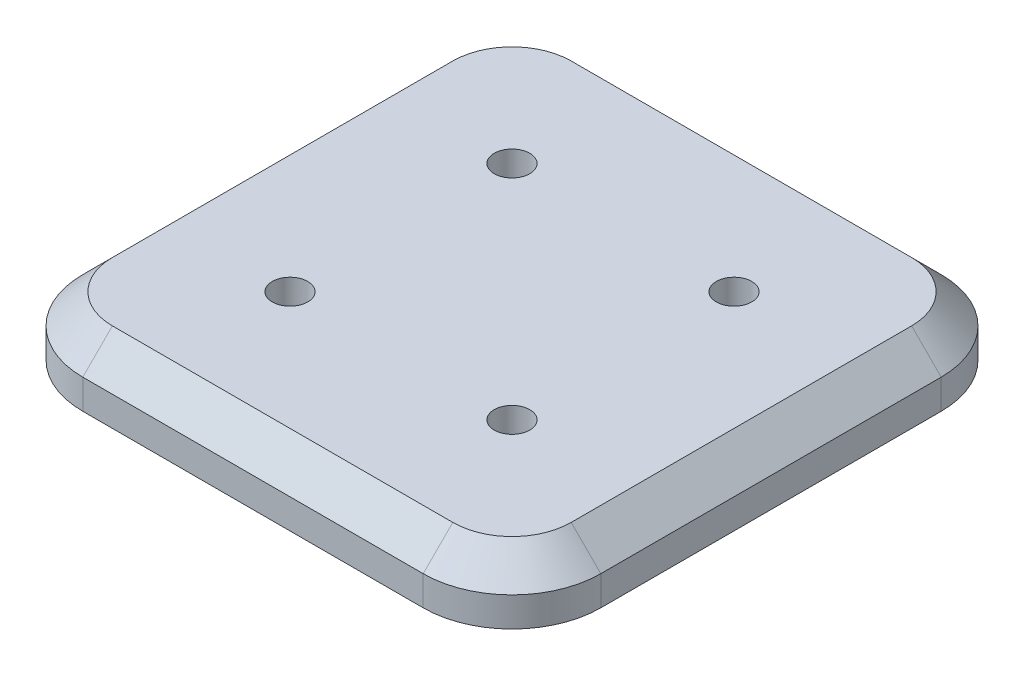
ISO-10303-21;
HEADER;
FILE_DESCRIPTION(('STEP AP214'),'2;1');
FILE_NAME('part.step','',(''),(''),'','','');
FILE_SCHEMA(('AUTOMOTIVE_DESIGN { 1 0 10303 214 1 1 1 1 }'));
ENDSEC;
DATA;
#1=APPLICATION_CONTEXT('core data for automotive mechanical design processes');
#2=APPLICATION_PROTOCOL_DEFINITION('international standard','automotive_design',2000,#1);
#3=PRODUCT_CONTEXT('',#1,'mechanical');
#4=PRODUCT('Part','Part','',(#3));
#5=PRODUCT_RELATED_PRODUCT_CATEGORY('part','',(#4));
#6=PRODUCT_DEFINITION_FORMATION('','',#4);
#7=PRODUCT_DEFINITION_CONTEXT('part definition',#1,'design');
#8=PRODUCT_DEFINITION('design','',#6,#7);
#9=PRODUCT_DEFINITION_SHAPE('','',#8);
#10=(LENGTH_UNIT() NAMED_UNIT(*) SI_UNIT(.MILLI.,.METRE.));
#11=(NAMED_UNIT(*) PLANE_ANGLE_UNIT() SI_UNIT($,.RADIAN.));
#12=(NAMED_UNIT(*) SI_UNIT($,.STERADIAN.) SOLID_ANGLE_UNIT());
#13=UNCERTAINTY_MEASURE_WITH_UNIT(LENGTH_MEASURE(1.E-05),#10,'distance_accuracy_value','');
#14=(GEOMETRIC_REPRESENTATION_CONTEXT(3) GLOBAL_UNCERTAINTY_ASSIGNED_CONTEXT((#13)) GLOBAL_UNIT_ASSIGNED_CONTEXT((#10,
#11,#12)) REPRESENTATION_CONTEXT('',''));
#15=CARTESIAN_POINT('',(0.,0.,0.));
#16=DIRECTION('',(0.,0.,1.));
#17=DIRECTION('',(1.,0.,0.));
#18=AXIS2_PLACEMENT_3D('',#15,#16,#17);
#19=CARTESIAN_POINT('',(-57.5,10.,57.5));
#20=DIRECTION('',(0.,-1.,0.));
#21=DIRECTION('',(0.,0.,-1.));
#22=AXIS2_PLACEMENT_3D('',#19,#20,#21);
#23=CYLINDRICAL_SURFACE('',#22,30.);
#24=DIRECTION('',(0.,-1.,0.));
#25=VECTOR('',#24,1.);
#26=CARTESIAN_POINT('',(-57.5,10.,87.5));
#27=LINE('',#26,#25);
#28=CARTESIAN_POINT('',(-57.5,0.,87.5));
#29=VERTEX_POINT('',#28);
#30=CARTESIAN_POINT('',(-57.5,-10.,87.5));
#31=VERTEX_POINT('',#30);
#32=EDGE_CURVE('E133',#29,#31,#27,.T.);
#33=ORIENTED_EDGE('',*,*,#32,.F.);
#34=CARTESIAN_POINT('',(-57.5,0.,57.5));
#35=DIRECTION('',(0.,-1.,0.));
#36=DIRECTION('',(0.,0.,-1.));
#37=AXIS2_PLACEMENT_3D('',#34,#35,#36);
#38=CIRCLE('',#37,30.);
#39=CARTESIAN_POINT('',(-87.5,0.,57.5));
#40=VERTEX_POINT('',#39);
#41=EDGE_CURVE('E12',#29,#40,#38,.T.);
#42=ORIENTED_EDGE('',*,*,#41,.T.);
#43=DIRECTION('',(0.,-1.,0.));
#44=VECTOR('',#43,1.);
#45=CARTESIAN_POINT('',(-87.5,10.,57.5));
#46=LINE('',#45,#44);
#47=CARTESIAN_POINT('',(-87.5,-10.,57.5));
#48=VERTEX_POINT('',#47);
#49=EDGE_CURVE('E156',#40,#48,#46,.T.);
#50=ORIENTED_EDGE('',*,*,#49,.T.);
#51=CARTESIAN_POINT('',(-57.5,-10.,57.5));
#52=DIRECTION('',(0.,1.,0.));
#53=DIRECTION('',(0.,0.,-1.));
#54=AXIS2_PLACEMENT_3D('',#51,#52,#53);
#55=CIRCLE('',#54,30.);
#56=EDGE_CURVE('E149',#48,#31,#55,.T.);
#57=ORIENTED_EDGE('',*,*,#56,.T.);
#58=EDGE_LOOP('',(#33,#42,#50,#57));
#59=FACE_BOUND('',#58,.T.);
#60=ADVANCED_FACE('F43',(#59),#23,.T.);
#61=CARTESIAN_POINT('',(57.5,10.,87.5));
#62=DIRECTION('',(0.,0.,-1.));
#63=DIRECTION('',(-1.,0.,0.));
#64=AXIS2_PLACEMENT_3D('',#61,#62,#63);
#65=PLANE('',#64);
#66=DIRECTION('',(0.,-1.,0.));
#67=VECTOR('',#66,1.);
#68=CARTESIAN_POINT('',(57.5,10.,87.5));
#69=LINE('',#68,#67);
#70=CARTESIAN_POINT('',(57.5,0.,87.5));
#71=VERTEX_POINT('',#70);
#72=CARTESIAN_POINT('',(57.5,-10.,87.5));
#73=VERTEX_POINT('',#72);
#74=EDGE_CURVE('E143',#71,#73,#69,.T.);
#75=ORIENTED_EDGE('',*,*,#74,.F.);
#76=DIRECTION('',(-1.,0.,0.));
#77=VECTOR('',#76,1.);
#78=CARTESIAN_POINT('',(57.5,0.,87.5));
#79=LINE('',#78,#77);
#80=EDGE_CURVE('E54',#71,#29,#79,.T.);
#81=ORIENTED_EDGE('',*,*,#80,.T.);
#82=ORIENTED_EDGE('',*,*,#32,.T.);
#83=DIRECTION('',(1.,0.,0.));
#84=VECTOR('',#83,1.);
#85=CARTESIAN_POINT('',(57.5,-10.,87.5));
#86=LINE('',#85,#84);
#87=EDGE_CURVE('E136',#31,#73,#86,.T.);
#88=ORIENTED_EDGE('',*,*,#87,.T.);
#89=EDGE_LOOP('',(#75,#81,#82,#88));
#90=FACE_BOUND('',#89,.T.);
#91=ADVANCED_FACE('F135',(#90),#65,.F.);
#92=CARTESIAN_POINT('',(57.5,10.,57.5));
#93=DIRECTION('',(0.,-1.,0.));
#94=DIRECTION('',(0.,0.,-1.));
#95=AXIS2_PLACEMENT_3D('',#92,#93,#94);
#96=CYLINDRICAL_SURFACE('',#95,30.);
#97=DIRECTION('',(0.,-1.,0.));
#98=VECTOR('',#97,1.);
#99=CARTESIAN_POINT('',(87.5,10.,57.5));
#100=LINE('',#99,#98);
#101=CARTESIAN_POINT('',(87.5,0.,57.5));
#102=VERTEX_POINT('',#101);
#103=CARTESIAN_POINT('',(87.5,-10.,57.5));
#104=VERTEX_POINT('',#103);
#105=EDGE_CURVE('E202',#102,#104,#100,.T.);
#106=ORIENTED_EDGE('',*,*,#105,.F.);
#107=CARTESIAN_POINT('',(57.5,0.,57.5));
#108=DIRECTION('',(0.,-1.,0.));
#109=DIRECTION('',(0.,0.,-1.));
#110=AXIS2_PLACEMENT_3D('',#107,#108,#109);
#111=CIRCLE('',#110,30.);
#112=EDGE_CURVE('E69',#102,#71,#111,.T.);
#113=ORIENTED_EDGE('',*,*,#112,.T.);
#114=ORIENTED_EDGE('',*,*,#74,.T.);
#115=CARTESIAN_POINT('',(57.5,-10.,57.5));
#116=DIRECTION('',(0.,1.,0.));
#117=DIRECTION('',(0.,0.,-1.));
#118=AXIS2_PLACEMENT_3D('',#115,#116,#117);
#119=CIRCLE('',#118,30.);
#120=EDGE_CURVE('E152',#73,#104,#119,.T.);
#121=ORIENTED_EDGE('',*,*,#120,.T.);
#122=EDGE_LOOP('',(#106,#113,#114,#121));
#123=FACE_BOUND('',#122,.T.);
#124=ADVANCED_FACE('F329',(#123),#96,.T.);
#125=CARTESIAN_POINT('',(87.5,10.,-57.5));
#126=DIRECTION('',(-1.,0.,0.));
#127=DIRECTION('',(0.,0.,1.));
#128=AXIS2_PLACEMENT_3D('',#125,#126,#127);
#129=PLANE('',#128);
#130=DIRECTION('',(0.,-1.,0.));
#131=VECTOR('',#130,1.);
#132=CARTESIAN_POINT('',(87.5,10.,-57.5));
#133=LINE('',#132,#131);
#134=CARTESIAN_POINT('',(87.5,0.,-57.5));
#135=VERTEX_POINT('',#134);
#136=CARTESIAN_POINT('',(87.5,-10.,-57.5));
#137=VERTEX_POINT('',#136);
#138=EDGE_CURVE('E199',#135,#137,#133,.T.);
#139=ORIENTED_EDGE('',*,*,#138,.F.);
#140=DIRECTION('',(0.,0.,1.));
#141=VECTOR('',#140,1.);
#142=CARTESIAN_POINT('',(87.5,0.,-57.5));
#143=LINE('',#142,#141);
#144=EDGE_CURVE('E244',#135,#102,#143,.T.);
#145=ORIENTED_EDGE('',*,*,#144,.T.);
#146=ORIENTED_EDGE('',*,*,#105,.T.);
#147=DIRECTION('',(0.,0.,-1.));
#148=VECTOR('',#147,1.);
#149=CARTESIAN_POINT('',(87.5,-10.,-57.5));
#150=LINE('',#149,#148);
#151=EDGE_CURVE('E169',#104,#137,#150,.T.);
#152=ORIENTED_EDGE('',*,*,#151,.T.);
#153=EDGE_LOOP('',(#139,#145,#146,#152));
#154=FACE_BOUND('',#153,.T.);
#155=ADVANCED_FACE('F327',(#154),#129,.F.);
#156=CARTESIAN_POINT('',(57.5,10.,-57.5));
#157=DIRECTION('',(0.,-1.,0.));
#158=DIRECTION('',(0.,0.,-1.));
#159=AXIS2_PLACEMENT_3D('',#156,#157,#158);
#160=CYLINDRICAL_SURFACE('',#159,30.);
#161=DIRECTION('',(0.,-1.,0.));
#162=VECTOR('',#161,1.);
#163=CARTESIAN_POINT('',(57.5,10.,-87.5));
#164=LINE('',#163,#162);
#165=CARTESIAN_POINT('',(57.5,0.,-87.5));
#166=VERTEX_POINT('',#165);
#167=CARTESIAN_POINT('',(57.5,-10.,-87.5));
#168=VERTEX_POINT('',#167);
#169=EDGE_CURVE('E196',#166,#168,#164,.T.);
#170=ORIENTED_EDGE('',*,*,#169,.F.);
#171=CARTESIAN_POINT('',(57.5,0.,-57.5));
#172=DIRECTION('',(0.,-1.,0.));
#173=DIRECTION('',(0.,0.,-1.));
#174=AXIS2_PLACEMENT_3D('',#171,#172,#173);
#175=CIRCLE('',#174,30.);
#176=EDGE_CURVE('E241',#166,#135,#175,.T.);
#177=ORIENTED_EDGE('',*,*,#176,.T.);
#178=ORIENTED_EDGE('',*,*,#138,.T.);
#179=CARTESIAN_POINT('',(57.5,-10.,-57.5));
#180=DIRECTION('',(0.,1.,0.));
#181=DIRECTION('',(0.,0.,-1.));
#182=AXIS2_PLACEMENT_3D('',#179,#180,#181);
#183=CIRCLE('',#182,30.);
#184=EDGE_CURVE('E173',#137,#168,#183,.T.);
#185=ORIENTED_EDGE('',*,*,#184,.T.);
#186=EDGE_LOOP('',(#170,#177,#178,#185));
#187=FACE_BOUND('',#186,.T.);
#188=ADVANCED_FACE('F325',(#187),#160,.T.);
#189=CARTESIAN_POINT('',(-57.5,10.,-87.5));
#190=DIRECTION('',(0.,0.,1.));
#191=DIRECTION('',(1.,0.,0.));
#192=AXIS2_PLACEMENT_3D('',#189,#190,#191);
#193=PLANE('',#192);
#194=DIRECTION('',(0.,-1.,0.));
#195=VECTOR('',#194,1.);
#196=CARTESIAN_POINT('',(-57.5,10.,-87.5));
#197=LINE('',#196,#195);
#198=CARTESIAN_POINT('',(-57.5,0.,-87.5));
#199=VERTEX_POINT('',#198);
#200=CARTESIAN_POINT('',(-57.5,-10.,-87.5));
#201=VERTEX_POINT('',#200);
#202=EDGE_CURVE('E193',#199,#201,#197,.T.);
#203=ORIENTED_EDGE('',*,*,#202,.F.);
#204=DIRECTION('',(1.,0.,0.));
#205=VECTOR('',#204,1.);
#206=CARTESIAN_POINT('',(-57.5,0.,-87.5));
#207=LINE('',#206,#205);
#208=EDGE_CURVE('E238',#199,#166,#207,.T.);
#209=ORIENTED_EDGE('',*,*,#208,.T.);
#210=ORIENTED_EDGE('',*,*,#169,.T.);
#211=DIRECTION('',(-1.,0.,0.));
#212=VECTOR('',#211,1.);
#213=CARTESIAN_POINT('',(-57.5,-10.,-87.5));
#214=LINE('',#213,#212);
#215=EDGE_CURVE('E177',#168,#201,#214,.T.);
#216=ORIENTED_EDGE('',*,*,#215,.T.);
#217=EDGE_LOOP('',(#203,#209,#210,#216));
#218=FACE_BOUND('',#217,.T.);
#219=ADVANCED_FACE('F313',(#218),#193,.F.);
#220=CARTESIAN_POINT('',(-57.5,10.,-57.5));
#221=DIRECTION('',(0.,-1.,0.));
#222=DIRECTION('',(0.,0.,-1.));
#223=AXIS2_PLACEMENT_3D('',#220,#221,#222);
#224=CYLINDRICAL_SURFACE('',#223,30.);
#225=DIRECTION('',(0.,-1.,0.));
#226=VECTOR('',#225,1.);
#227=CARTESIAN_POINT('',(-87.5,10.,-57.5));
#228=LINE('',#227,#226);
#229=CARTESIAN_POINT('',(-87.5,0.,-57.5));
#230=VERTEX_POINT('',#229);
#231=CARTESIAN_POINT('',(-87.5,-10.,-57.5));
#232=VERTEX_POINT('',#231);
#233=EDGE_CURVE('E190',#230,#232,#228,.T.);
#234=ORIENTED_EDGE('',*,*,#233,.F.);
#235=CARTESIAN_POINT('',(-57.5,0.,-57.5));
#236=DIRECTION('',(0.,-1.,0.));
#237=DIRECTION('',(0.,0.,-1.));
#238=AXIS2_PLACEMENT_3D('',#235,#236,#237);
#239=CIRCLE('',#238,30.);
#240=EDGE_CURVE('E235',#230,#199,#239,.T.);
#241=ORIENTED_EDGE('',*,*,#240,.T.);
#242=ORIENTED_EDGE('',*,*,#202,.T.);
#243=CARTESIAN_POINT('',(-57.5,-10.,-57.5));
#244=DIRECTION('',(0.,1.,0.));
#245=DIRECTION('',(0.,0.,1.));
#246=AXIS2_PLACEMENT_3D('',#243,#244,#245);
#247=CIRCLE('',#246,30.);
#248=EDGE_CURVE('E181',#201,#232,#247,.T.);
#249=ORIENTED_EDGE('',*,*,#248,.T.);
#250=EDGE_LOOP('',(#234,#241,#242,#249));
#251=FACE_BOUND('',#250,.T.);
#252=ADVANCED_FACE('F310',(#251),#224,.T.);
#253=CARTESIAN_POINT('',(-87.5,10.,57.5));
#254=DIRECTION('',(1.,0.,0.));
#255=DIRECTION('',(0.,0.,-1.));
#256=AXIS2_PLACEMENT_3D('',#253,#254,#255);
#257=PLANE('',#256);
#258=ORIENTED_EDGE('',*,*,#49,.F.);
#259=DIRECTION('',(0.,0.,-1.));
#260=VECTOR('',#259,1.);
#261=CARTESIAN_POINT('',(-87.5,0.,57.5));
#262=LINE('',#261,#260);
#263=EDGE_CURVE('E231',#40,#230,#262,.T.);
#264=ORIENTED_EDGE('',*,*,#263,.T.);
#265=ORIENTED_EDGE('',*,*,#233,.T.);
#266=DIRECTION('',(0.,0.,1.));
#267=VECTOR('',#266,1.);
#268=CARTESIAN_POINT('',(-87.5,-10.,57.5));
#269=LINE('',#268,#267);
#270=EDGE_CURVE('E185',#232,#48,#269,.T.);
#271=ORIENTED_EDGE('',*,*,#270,.T.);
#272=EDGE_LOOP('',(#258,#264,#265,#271));
#273=FACE_BOUND('',#272,.T.);
#274=ADVANCED_FACE('F297',(#273),#257,.F.);
#275=CARTESIAN_POINT('',(-57.5,10.,57.5));
#276=DIRECTION('',(0.,-1.,0.));
#277=DIRECTION('',(0.,0.,-1.));
#278=AXIS2_PLACEMENT_3D('',#275,#276,#277);
#279=PLANE('',#278);
#280=CARTESIAN_POINT('',(-37.5,10.,-37.5));
#281=DIRECTION('',(0.,1.,0.));
#282=DIRECTION('',(0.,0.,-1.));
#283=AXIS2_PLACEMENT_3D('',#280,#281,#282);
#284=CIRCLE('',#283,6.);
#285=CARTESIAN_POINT('',(-37.5,10.,-43.5));
#286=VERTEX_POINT('',#285);
#287=EDGE_CURVE('E629',#286,#286,#284,.T.);
#288=ORIENTED_EDGE('',*,*,#287,.F.);
#289=EDGE_LOOP('',(#288));
#290=FACE_BOUND('',#289,.T.);
#291=CARTESIAN_POINT('',(37.5,10.,37.5));
#292=DIRECTION('',(0.,1.,0.));
#293=DIRECTION('',(0.,0.,-1.));
#294=AXIS2_PLACEMENT_3D('',#291,#292,#293);
#295=CIRCLE('',#294,6.);
#296=CARTESIAN_POINT('',(37.5,10.,31.5));
#297=VERTEX_POINT('',#296);
#298=EDGE_CURVE('E628',#297,#297,#295,.T.);
#299=ORIENTED_EDGE('',*,*,#298,.F.);
#300=EDGE_LOOP('',(#299));
#301=FACE_BOUND('',#300,.T.);
#302=CARTESIAN_POINT('',(-37.5,10.,37.5));
#303=DIRECTION('',(0.,1.,0.));
#304=DIRECTION('',(0.,0.,1.));
#305=AXIS2_PLACEMENT_3D('',#302,#303,#304);
#306=CIRCLE('',#305,6.);
#307=CARTESIAN_POINT('',(-37.5,10.,43.5));
#308=VERTEX_POINT('',#307);
#309=EDGE_CURVE('E620',#308,#308,#306,.T.);
#310=ORIENTED_EDGE('',*,*,#309,.F.);
#311=EDGE_LOOP('',(#310));
#312=FACE_BOUND('',#311,.T.);
#313=CARTESIAN_POINT('',(37.5,10.,-37.5));
#314=DIRECTION('',(0.,1.,0.));
#315=DIRECTION('',(0.,0.,1.));
#316=AXIS2_PLACEMENT_3D('',#313,#314,#315);
#317=CIRCLE('',#316,6.);
#318=CARTESIAN_POINT('',(37.5,10.,-31.5));
#319=VERTEX_POINT('',#318);
#320=EDGE_CURVE('E638',#319,#319,#317,.T.);
#321=ORIENTED_EDGE('',*,*,#320,.F.);
#322=EDGE_LOOP('',(#321));
#323=FACE_BOUND('',#322,.T.);
#324=CARTESIAN_POINT('',(-57.5,10.,-57.5));
#325=DIRECTION('',(0.,-1.,0.));
#326=DIRECTION('',(0.,0.,-1.));
#327=AXIS2_PLACEMENT_3D('',#324,#325,#326);
#328=CIRCLE('',#327,20.);
#329=CARTESIAN_POINT('',(-57.5,10.,-77.5));
#330=VERTEX_POINT('',#329);
#331=CARTESIAN_POINT('',(-77.5,10.,-57.5));
#332=VERTEX_POINT('',#331);
#333=EDGE_CURVE('E224',#330,#332,#328,.F.);
#334=ORIENTED_EDGE('',*,*,#333,.T.);
#335=DIRECTION('',(0.,0.,1.));
#336=VECTOR('',#335,1.);
#337=CARTESIAN_POINT('',(-77.5,10.,57.5));
#338=LINE('',#337,#336);
#339=CARTESIAN_POINT('',(-77.5,10.,57.5));
#340=VERTEX_POINT('',#339);
#341=EDGE_CURVE('E227',#332,#340,#338,.T.);
#342=ORIENTED_EDGE('',*,*,#341,.T.);
#343=CARTESIAN_POINT('',(-57.5,10.,57.5));
#344=DIRECTION('',(0.,-1.,0.));
#345=DIRECTION('',(0.,0.,-1.));
#346=AXIS2_PLACEMENT_3D('',#343,#344,#345);
#347=CIRCLE('',#346,19.9999999999999);
#348=CARTESIAN_POINT('',(-57.5,10.,77.5));
#349=VERTEX_POINT('',#348);
#350=EDGE_CURVE('E142',#340,#349,#347,.F.);
#351=ORIENTED_EDGE('',*,*,#350,.T.);
#352=DIRECTION('',(1.,0.,0.));
#353=VECTOR('',#352,1.);
#354=CARTESIAN_POINT('',(-57.5,10.,77.5));
#355=LINE('',#354,#353);
#356=CARTESIAN_POINT('',(57.5,10.,77.5));
#357=VERTEX_POINT('',#356);
#358=EDGE_CURVE('E209',#349,#357,#355,.T.);
#359=ORIENTED_EDGE('',*,*,#358,.T.);
#360=CARTESIAN_POINT('',(57.5,10.,57.5));
#361=DIRECTION('',(0.,-1.,0.));
#362=DIRECTION('',(0.,0.,-1.));
#363=AXIS2_PLACEMENT_3D('',#360,#361,#362);
#364=CIRCLE('',#363,19.9999999999999);
#365=CARTESIAN_POINT('',(77.5,10.,57.5));
#366=VERTEX_POINT('',#365);
#367=EDGE_CURVE('E212',#357,#366,#364,.F.);
#368=ORIENTED_EDGE('',*,*,#367,.T.);
#369=DIRECTION('',(0.,0.,-1.));
#370=VECTOR('',#369,1.);
#371=CARTESIAN_POINT('',(77.5,10.,57.5));
#372=LINE('',#371,#370);
#373=CARTESIAN_POINT('',(77.5,10.,-57.5));
#374=VERTEX_POINT('',#373);
#375=EDGE_CURVE('E215',#366,#374,#372,.T.);
#376=ORIENTED_EDGE('',*,*,#375,.T.);
#377=CARTESIAN_POINT('',(57.5,10.,-57.5));
#378=DIRECTION('',(0.,-1.,0.));
#379=DIRECTION('',(0.,0.,-1.));
#380=AXIS2_PLACEMENT_3D('',#377,#378,#379);
#381=CIRCLE('',#380,20.);
#382=CARTESIAN_POINT('',(57.5,10.,-77.5));
#383=VERTEX_POINT('',#382);
#384=EDGE_CURVE('E218',#374,#383,#381,.F.);
#385=ORIENTED_EDGE('',*,*,#384,.T.);
#386=DIRECTION('',(-1.,0.,0.));
#387=VECTOR('',#386,1.);
#388=CARTESIAN_POINT('',(-57.5,10.,-77.5));
#389=LINE('',#388,#387);
#390=EDGE_CURVE('E221',#383,#330,#389,.T.);
#391=ORIENTED_EDGE('',*,*,#390,.T.);
#392=EDGE_LOOP('',(#334,#342,#351,#359,#368,#376,#385,#391));
#393=FACE_BOUND('',#392,.T.);
#394=ADVANCED_FACE('F285',(#290,#301,#312,#323,#393),#279,.F.);
#395=CARTESIAN_POINT('',(-57.5,-10.,57.5));
#396=DIRECTION('',(0.,-1.,0.));
#397=DIRECTION('',(0.,0.,-1.));
#398=AXIS2_PLACEMENT_3D('',#395,#396,#397);
#399=PLANE('',#398);
#400=CARTESIAN_POINT('',(-62.5,-10.,62.5));
#401=DIRECTION('',(0.,-1.,0.));
#402=DIRECTION('',(0.,0.,1.));
#403=AXIS2_PLACEMENT_3D('',#400,#401,#402);
#404=CIRCLE('',#403,6.);
#405=CARTESIAN_POINT('',(-62.5,-10.,68.5));
#406=VERTEX_POINT('',#405);
#407=EDGE_CURVE('E597',#406,#406,#404,.T.);
#408=ORIENTED_EDGE('',*,*,#407,.F.);
#409=EDGE_LOOP('',(#408));
#410=FACE_BOUND('',#409,.T.);
#411=CARTESIAN_POINT('',(62.5,-10.,-62.5));
#412=DIRECTION('',(0.,-1.,0.));
#413=DIRECTION('',(0.,0.,1.));
#414=AXIS2_PLACEMENT_3D('',#411,#412,#413);
#415=CIRCLE('',#414,6.);
#416=CARTESIAN_POINT('',(62.5,-10.,-56.5));
#417=VERTEX_POINT('',#416);
#418=EDGE_CURVE('E609',#417,#417,#415,.T.);
#419=ORIENTED_EDGE('',*,*,#418,.F.);
#420=EDGE_LOOP('',(#419));
#421=FACE_BOUND('',#420,.T.);
#422=CARTESIAN_POINT('',(-62.5,-10.,-62.5));
#423=DIRECTION('',(0.,-1.,0.));
#424=DIRECTION('',(0.,0.,-1.));
#425=AXIS2_PLACEMENT_3D('',#422,#423,#424);
#426=CIRCLE('',#425,6.);
#427=CARTESIAN_POINT('',(-62.5,-10.,-68.5));
#428=VERTEX_POINT('',#427);
#429=EDGE_CURVE('E673',#428,#428,#426,.T.);
#430=ORIENTED_EDGE('',*,*,#429,.F.);
#431=EDGE_LOOP('',(#430));
#432=FACE_BOUND('',#431,.T.);
#433=CARTESIAN_POINT('',(62.5,-10.,62.5));
#434=DIRECTION('',(0.,-1.,0.));
#435=DIRECTION('',(0.,0.,-1.));
#436=AXIS2_PLACEMENT_3D('',#433,#434,#435);
#437=CIRCLE('',#436,6.);
#438=CARTESIAN_POINT('',(62.5,-10.,56.5));
#439=VERTEX_POINT('',#438);
#440=EDGE_CURVE('E596',#439,#439,#437,.T.);
#441=ORIENTED_EDGE('',*,*,#440,.F.);
#442=EDGE_LOOP('',(#441));
#443=FACE_BOUND('',#442,.T.);
#444=ORIENTED_EDGE('',*,*,#56,.F.);
#445=ORIENTED_EDGE('',*,*,#270,.F.);
#446=ORIENTED_EDGE('',*,*,#248,.F.);
#447=ORIENTED_EDGE('',*,*,#215,.F.);
#448=ORIENTED_EDGE('',*,*,#184,.F.);
#449=ORIENTED_EDGE('',*,*,#151,.F.);
#450=ORIENTED_EDGE('',*,*,#120,.F.);
#451=ORIENTED_EDGE('',*,*,#87,.F.);
#452=EDGE_LOOP('',(#444,#445,#446,#447,#448,#449,#450,#451));
#453=FACE_BOUND('',#452,.T.);
#454=ADVANCED_FACE('F147',(#410,#421,#432,#443,#453),#399,.T.);
#455=CARTESIAN_POINT('',(77.5,10.,57.5));
#456=DIRECTION('',(-0.707106781186548,-0.707106781186547,0.));
#457=DIRECTION('',(0.,0.,-1.));
#458=AXIS2_PLACEMENT_3D('',#455,#456,#457);
#459=PLANE('',#458);
#460=DIRECTION('',(-0.707106781186547,0.707106781186548,0.));
#461=VECTOR('',#460,1.);
#462=CARTESIAN_POINT('',(87.5,0.,57.5));
#463=LINE('',#462,#461);
#464=EDGE_CURVE('E162',#102,#366,#463,.T.);
#465=ORIENTED_EDGE('',*,*,#464,.F.);
#466=ORIENTED_EDGE('',*,*,#144,.F.);
#467=DIRECTION('',(0.707106781186547,-0.707106781186548,0.));
#468=VECTOR('',#467,1.);
#469=CARTESIAN_POINT('',(77.5,10.,-57.5));
#470=LINE('',#469,#468);
#471=EDGE_CURVE('E48',#374,#135,#470,.T.);
#472=ORIENTED_EDGE('',*,*,#471,.F.);
#473=ORIENTED_EDGE('',*,*,#375,.F.);
#474=EDGE_LOOP('',(#465,#466,#472,#473));
#475=FACE_BOUND('',#474,.T.);
#476=ADVANCED_FACE('F46',(#475),#459,.F.);
#477=CARTESIAN_POINT('',(57.5,10.,-57.5));
#478=DIRECTION('',(0.,-1.,0.));
#479=DIRECTION('',(0.,0.,-1.));
#480=AXIS2_PLACEMENT_3D('',#477,#478,#479);
#481=CONICAL_SURFACE('',#480,20.,0.785398163397448);
#482=ORIENTED_EDGE('',*,*,#471,.T.);
#483=ORIENTED_EDGE('',*,*,#176,.F.);
#484=DIRECTION('',(0.,-0.707106781186548,-0.707106781186547));
#485=VECTOR('',#484,1.);
#486=CARTESIAN_POINT('',(57.5,10.,-77.5));
#487=LINE('',#486,#485);
#488=EDGE_CURVE('E269',#383,#166,#487,.T.);
#489=ORIENTED_EDGE('',*,*,#488,.F.);
#490=ORIENTED_EDGE('',*,*,#384,.F.);
#491=EDGE_LOOP('',(#482,#483,#489,#490));
#492=FACE_BOUND('',#491,.T.);
#493=ADVANCED_FACE('F322',(#492),#481,.T.);
#494=CARTESIAN_POINT('',(57.5,10.,57.5));
#495=DIRECTION('',(0.,-1.,0.));
#496=DIRECTION('',(0.,0.,-1.));
#497=AXIS2_PLACEMENT_3D('',#494,#495,#496);
#498=CONICAL_SURFACE('',#497,19.9999999999999,0.785398163397448);
#499=ORIENTED_EDGE('',*,*,#464,.T.);
#500=ORIENTED_EDGE('',*,*,#367,.F.);
#501=DIRECTION('',(0.,0.707106781186548,-0.707106781186547));
#502=VECTOR('',#501,1.);
#503=CARTESIAN_POINT('',(57.5,0.,87.5));
#504=LINE('',#503,#502);
#505=EDGE_CURVE('E265',#71,#357,#504,.T.);
#506=ORIENTED_EDGE('',*,*,#505,.F.);
#507=ORIENTED_EDGE('',*,*,#112,.F.);
#508=EDGE_LOOP('',(#499,#500,#506,#507));
#509=FACE_BOUND('',#508,.T.);
#510=ADVANCED_FACE('F277',(#509),#498,.T.);
#511=CARTESIAN_POINT('',(-57.5,10.,-77.5));
#512=DIRECTION('',(0.,-0.707106781186547,0.707106781186548));
#513=DIRECTION('',(-1.,0.,0.));
#514=AXIS2_PLACEMENT_3D('',#511,#512,#513);
#515=PLANE('',#514);
#516=ORIENTED_EDGE('',*,*,#488,.T.);
#517=ORIENTED_EDGE('',*,*,#208,.F.);
#518=DIRECTION('',(0.,-0.707106781186548,-0.707106781186547));
#519=VECTOR('',#518,1.);
#520=CARTESIAN_POINT('',(-57.5,10.,-77.5));
#521=LINE('',#520,#519);
#522=EDGE_CURVE('E261',#330,#199,#521,.T.);
#523=ORIENTED_EDGE('',*,*,#522,.F.);
#524=ORIENTED_EDGE('',*,*,#390,.F.);
#525=EDGE_LOOP('',(#516,#517,#523,#524));
#526=FACE_BOUND('',#525,.T.);
#527=ADVANCED_FACE('F318',(#526),#515,.F.);
#528=CARTESIAN_POINT('',(-57.5,10.,77.5));
#529=DIRECTION('',(0.,-0.707106781186547,-0.707106781186548));
#530=DIRECTION('',(1.,0.,0.));
#531=AXIS2_PLACEMENT_3D('',#528,#529,#530);
#532=PLANE('',#531);
#533=ORIENTED_EDGE('',*,*,#505,.T.);
#534=ORIENTED_EDGE('',*,*,#358,.F.);
#535=DIRECTION('',(0.,0.707106781186548,-0.707106781186547));
#536=VECTOR('',#535,1.);
#537=CARTESIAN_POINT('',(-57.5,0.,87.5));
#538=LINE('',#537,#536);
#539=EDGE_CURVE('E257',#29,#349,#538,.T.);
#540=ORIENTED_EDGE('',*,*,#539,.F.);
#541=ORIENTED_EDGE('',*,*,#80,.F.);
#542=EDGE_LOOP('',(#533,#534,#540,#541));
#543=FACE_BOUND('',#542,.T.);
#544=ADVANCED_FACE('F290',(#543),#532,.F.);
#545=CARTESIAN_POINT('',(-57.5,10.,-57.5));
#546=DIRECTION('',(0.,-1.,0.));
#547=DIRECTION('',(0.,0.,-1.));
#548=AXIS2_PLACEMENT_3D('',#545,#546,#547);
#549=CONICAL_SURFACE('',#548,20.,0.785398163397447);
#550=ORIENTED_EDGE('',*,*,#522,.T.);
#551=ORIENTED_EDGE('',*,*,#240,.F.);
#552=DIRECTION('',(-0.707106781186547,-0.707106781186548,0.));
#553=VECTOR('',#552,1.);
#554=CARTESIAN_POINT('',(-77.5,10.,-57.5));
#555=LINE('',#554,#553);
#556=EDGE_CURVE('E254',#332,#230,#555,.T.);
#557=ORIENTED_EDGE('',*,*,#556,.F.);
#558=ORIENTED_EDGE('',*,*,#333,.F.);
#559=EDGE_LOOP('',(#550,#551,#557,#558));
#560=FACE_BOUND('',#559,.T.);
#561=ADVANCED_FACE('F306',(#560),#549,.T.);
#562=CARTESIAN_POINT('',(-57.5,10.,57.5));
#563=DIRECTION('',(0.,-1.,0.));
#564=DIRECTION('',(0.,0.,-1.));
#565=AXIS2_PLACEMENT_3D('',#562,#563,#564);
#566=CONICAL_SURFACE('',#565,19.9999999999999,0.785398163397448);
#567=ORIENTED_EDGE('',*,*,#539,.T.);
#568=ORIENTED_EDGE('',*,*,#350,.F.);
#569=DIRECTION('',(0.707106781186547,0.707106781186548,0.));
#570=VECTOR('',#569,1.);
#571=CARTESIAN_POINT('',(-87.5,0.,57.5));
#572=LINE('',#571,#570);
#573=EDGE_CURVE('E251',#40,#340,#572,.T.);
#574=ORIENTED_EDGE('',*,*,#573,.F.);
#575=ORIENTED_EDGE('',*,*,#41,.F.);
#576=EDGE_LOOP('',(#567,#568,#574,#575));
#577=FACE_BOUND('',#576,.T.);
#578=ADVANCED_FACE('F293',(#577),#566,.T.);
#579=CARTESIAN_POINT('',(-77.5,10.,57.5));
#580=DIRECTION('',(0.707106781186548,-0.707106781186547,0.));
#581=DIRECTION('',(0.,0.,1.));
#582=AXIS2_PLACEMENT_3D('',#579,#580,#581);
#583=PLANE('',#582);
#584=ORIENTED_EDGE('',*,*,#556,.T.);
#585=ORIENTED_EDGE('',*,*,#263,.F.);
#586=ORIENTED_EDGE('',*,*,#573,.T.);
#587=ORIENTED_EDGE('',*,*,#341,.F.);
#588=EDGE_LOOP('',(#584,#585,#586,#587));
#589=FACE_BOUND('',#588,.T.);
#590=ADVANCED_FACE('F300',(#589),#583,.F.);
#591=CARTESIAN_POINT('',(-57.5,0.,57.5));
#592=DIRECTION('',(0.,-1.,0.));
#593=DIRECTION('',(0.,0.,-1.));
#594=AXIS2_PLACEMENT_3D('',#591,#592,#593);
#595=PLANE('',#594);
#596=CARTESIAN_POINT('',(37.5,0.,-37.5));
#597=DIRECTION('',(0.,-1.,0.));
#598=DIRECTION('',(0.,0.,-1.));
#599=AXIS2_PLACEMENT_3D('',#596,#597,#598);
#600=CIRCLE('',#599,6.);
#601=CARTESIAN_POINT('',(37.5,0.,-43.5));
#602=VERTEX_POINT('',#601);
#603=EDGE_CURVE('E164',#602,#602,#600,.F.);
#604=ORIENTED_EDGE('',*,*,#603,.T.);
#605=EDGE_LOOP('',(#604));
#606=FACE_BOUND('',#605,.T.);
#607=ADVANCED_FACE('F349',(#606),#595,.F.);
#608=CARTESIAN_POINT('',(37.5,-26.9705627484772,-37.5));
#609=DIRECTION('',(0.,1.,0.));
#610=DIRECTION('',(0.,0.,1.));
#611=AXIS2_PLACEMENT_3D('',#608,#609,#610);
#612=CYLINDRICAL_SURFACE('',#611,6.);
#613=ORIENTED_EDGE('',*,*,#320,.T.);
#614=EDGE_LOOP('',(#613));
#615=FACE_BOUND('',#614,.T.);
#616=ORIENTED_EDGE('',*,*,#603,.F.);
#617=EDGE_LOOP('',(#616));
#618=FACE_BOUND('',#617,.T.);
#619=ADVANCED_FACE('F435',(#615,#618),#612,.F.);
#620=CARTESIAN_POINT('',(-57.5,0.,57.5));
#621=DIRECTION('',(0.,-1.,0.));
#622=DIRECTION('',(0.,0.,-1.));
#623=AXIS2_PLACEMENT_3D('',#620,#621,#622);
#624=PLANE('',#623);
#625=CARTESIAN_POINT('',(-37.5,0.,37.5));
#626=DIRECTION('',(0.,-1.,0.));
#627=DIRECTION('',(0.,0.,-1.));
#628=AXIS2_PLACEMENT_3D('',#625,#626,#627);
#629=CIRCLE('',#628,6.);
#630=CARTESIAN_POINT('',(-37.5,0.,31.5));
#631=VERTEX_POINT('',#630);
#632=EDGE_CURVE('E624',#631,#631,#629,.F.);
#633=ORIENTED_EDGE('',*,*,#632,.T.);
#634=EDGE_LOOP('',(#633));
#635=FACE_BOUND('',#634,.T.);
#636=ADVANCED_FACE('F444',(#635),#624,.F.);
#637=CARTESIAN_POINT('',(-37.5,-26.9705627484772,37.5));
#638=DIRECTION('',(0.,1.,0.));
#639=DIRECTION('',(0.,0.,1.));
#640=AXIS2_PLACEMENT_3D('',#637,#638,#639);
#641=CYLINDRICAL_SURFACE('',#640,6.);
#642=ORIENTED_EDGE('',*,*,#309,.T.);
#643=EDGE_LOOP('',(#642));
#644=FACE_BOUND('',#643,.T.);
#645=ORIENTED_EDGE('',*,*,#632,.F.);
#646=EDGE_LOOP('',(#645));
#647=FACE_BOUND('',#646,.T.);
#648=ADVANCED_FACE('F454',(#644,#647),#641,.F.);
#649=CARTESIAN_POINT('',(-57.5,0.,57.5));
#650=DIRECTION('',(0.,-1.,0.));
#651=DIRECTION('',(0.,0.,-1.));
#652=AXIS2_PLACEMENT_3D('',#649,#650,#651);
#653=PLANE('',#652);
#654=CARTESIAN_POINT('',(37.5,0.,37.5));
#655=DIRECTION('',(0.,-1.,0.));
#656=DIRECTION('',(0.,0.,-1.));
#657=AXIS2_PLACEMENT_3D('',#654,#655,#656);
#658=CIRCLE('',#657,6.);
#659=CARTESIAN_POINT('',(37.5,0.,31.5));
#660=VERTEX_POINT('',#659);
#661=EDGE_CURVE('E634',#660,#660,#658,.F.);
#662=ORIENTED_EDGE('',*,*,#661,.T.);
#663=EDGE_LOOP('',(#662));
#664=FACE_BOUND('',#663,.T.);
#665=ADVANCED_FACE('F464',(#664),#653,.F.);
#666=CARTESIAN_POINT('',(37.5,-26.9705627484772,37.5));
#667=DIRECTION('',(0.,1.,0.));
#668=DIRECTION('',(0.,0.,1.));
#669=AXIS2_PLACEMENT_3D('',#666,#667,#668);
#670=CYLINDRICAL_SURFACE('',#669,6.);
#671=ORIENTED_EDGE('',*,*,#298,.T.);
#672=EDGE_LOOP('',(#671));
#673=FACE_BOUND('',#672,.T.);
#674=ORIENTED_EDGE('',*,*,#661,.F.);
#675=EDGE_LOOP('',(#674));
#676=FACE_BOUND('',#675,.T.);
#677=ADVANCED_FACE('F474',(#673,#676),#670,.F.);
#678=CARTESIAN_POINT('',(-57.5,0.,57.5));
#679=DIRECTION('',(0.,-1.,0.));
#680=DIRECTION('',(0.,0.,-1.));
#681=AXIS2_PLACEMENT_3D('',#678,#679,#680);
#682=PLANE('',#681);
#683=CARTESIAN_POINT('',(-37.5,0.,-37.5));
#684=DIRECTION('',(0.,-1.,0.));
#685=DIRECTION('',(0.,0.,-1.));
#686=AXIS2_PLACEMENT_3D('',#683,#684,#685);
#687=CIRCLE('',#686,6.);
#688=CARTESIAN_POINT('',(-37.5,0.,-43.5));
#689=VERTEX_POINT('',#688);
#690=EDGE_CURVE('E633',#689,#689,#687,.F.);
#691=ORIENTED_EDGE('',*,*,#690,.T.);
#692=EDGE_LOOP('',(#691));
#693=FACE_BOUND('',#692,.T.);
#694=ADVANCED_FACE('F484',(#693),#682,.F.);
#695=CARTESIAN_POINT('',(-37.5,-26.9705627484772,-37.5));
#696=DIRECTION('',(0.,1.,0.));
#697=DIRECTION('',(0.,0.,1.));
#698=AXIS2_PLACEMENT_3D('',#695,#696,#697);
#699=CYLINDRICAL_SURFACE('',#698,6.);
#700=ORIENTED_EDGE('',*,*,#287,.T.);
#701=EDGE_LOOP('',(#700));
#702=FACE_BOUND('',#701,.T.);
#703=ORIENTED_EDGE('',*,*,#690,.F.);
#704=EDGE_LOOP('',(#703));
#705=FACE_BOUND('',#704,.T.);
#706=ADVANCED_FACE('F494',(#702,#705),#699,.F.);
#707=CARTESIAN_POINT('',(62.5,26.9705627484772,62.5));
#708=DIRECTION('',(0.,-1.,0.));
#709=DIRECTION('',(0.,0.,-1.));
#710=AXIS2_PLACEMENT_3D('',#707,#708,#709);
#711=CYLINDRICAL_SURFACE('',#710,6.);
#712=CARTESIAN_POINT('',(62.5,0.,62.5));
#713=DIRECTION('',(0.,-1.,0.));
#714=DIRECTION('',(0.,0.,-1.));
#715=AXIS2_PLACEMENT_3D('',#712,#713,#714);
#716=CIRCLE('',#715,6.);
#717=CARTESIAN_POINT('',(62.5,0.,56.5));
#718=VERTEX_POINT('',#717);
#719=EDGE_CURVE('E602',#718,#718,#716,.F.);
#720=ORIENTED_EDGE('',*,*,#719,.T.);
#721=EDGE_LOOP('',(#720));
#722=FACE_BOUND('',#721,.T.);
#723=ORIENTED_EDGE('',*,*,#440,.T.);
#724=EDGE_LOOP('',(#723));
#725=FACE_BOUND('',#724,.T.);
#726=ADVANCED_FACE('F503',(#722,#725),#711,.F.);
#727=CARTESIAN_POINT('',(-57.5,0.,57.5));
#728=DIRECTION('',(0.,-1.,0.));
#729=DIRECTION('',(0.,0.,-1.));
#730=AXIS2_PLACEMENT_3D('',#727,#728,#729);
#731=PLANE('',#730);
#732=ORIENTED_EDGE('',*,*,#719,.F.);
#733=EDGE_LOOP('',(#732));
#734=FACE_BOUND('',#733,.T.);
#735=ADVANCED_FACE('F518',(#734),#731,.T.);
#736=CARTESIAN_POINT('',(-62.5,26.9705627484772,-62.5));
#737=DIRECTION('',(0.,-1.,0.));
#738=DIRECTION('',(0.,0.,-1.));
#739=AXIS2_PLACEMENT_3D('',#736,#737,#738);
#740=CYLINDRICAL_SURFACE('',#739,6.);
#741=CARTESIAN_POINT('',(-62.5,0.,-62.5));
#742=DIRECTION('',(0.,-1.,0.));
#743=DIRECTION('',(0.,0.,-1.));
#744=AXIS2_PLACEMENT_3D('',#741,#742,#743);
#745=CIRCLE('',#744,6.);
#746=CARTESIAN_POINT('',(-62.5,0.,-68.5));
#747=VERTEX_POINT('',#746);
#748=EDGE_CURVE('E613',#747,#747,#745,.F.);
#749=ORIENTED_EDGE('',*,*,#748,.T.);
#750=EDGE_LOOP('',(#749));
#751=FACE_BOUND('',#750,.T.);
#752=ORIENTED_EDGE('',*,*,#429,.T.);
#753=EDGE_LOOP('',(#752));
#754=FACE_BOUND('',#753,.T.);
#755=ADVANCED_FACE('F528',(#751,#754),#740,.F.);
#756=CARTESIAN_POINT('',(-57.5,0.,57.5));
#757=DIRECTION('',(0.,-1.,0.));
#758=DIRECTION('',(0.,0.,-1.));
#759=AXIS2_PLACEMENT_3D('',#756,#757,#758);
#760=PLANE('',#759);
#761=ORIENTED_EDGE('',*,*,#748,.F.);
#762=EDGE_LOOP('',(#761));
#763=FACE_BOUND('',#762,.T.);
#764=ADVANCED_FACE('F538',(#763),#760,.T.);
#765=CARTESIAN_POINT('',(62.5,26.9705627484772,-62.5));
#766=DIRECTION('',(0.,-1.,0.));
#767=DIRECTION('',(0.,0.,-1.));
#768=AXIS2_PLACEMENT_3D('',#765,#766,#767);
#769=CYLINDRICAL_SURFACE('',#768,6.);
#770=CARTESIAN_POINT('',(62.5,0.,-62.5));
#771=DIRECTION('',(0.,-1.,0.));
#772=DIRECTION('',(0.,0.,-1.));
#773=AXIS2_PLACEMENT_3D('',#770,#771,#772);
#774=CIRCLE('',#773,6.);
#775=CARTESIAN_POINT('',(62.5,0.,-68.5));
#776=VERTEX_POINT('',#775);
#777=EDGE_CURVE('E605',#776,#776,#774,.F.);
#778=ORIENTED_EDGE('',*,*,#777,.T.);
#779=EDGE_LOOP('',(#778));
#780=FACE_BOUND('',#779,.T.);
#781=ORIENTED_EDGE('',*,*,#418,.T.);
#782=EDGE_LOOP('',(#781));
#783=FACE_BOUND('',#782,.T.);
#784=ADVANCED_FACE('F548',(#780,#783),#769,.F.);
#785=CARTESIAN_POINT('',(-57.5,0.,57.5));
#786=DIRECTION('',(0.,-1.,0.));
#787=DIRECTION('',(0.,0.,-1.));
#788=AXIS2_PLACEMENT_3D('',#785,#786,#787);
#789=PLANE('',#788);
#790=ORIENTED_EDGE('',*,*,#777,.F.);
#791=EDGE_LOOP('',(#790));
#792=FACE_BOUND('',#791,.T.);
#793=ADVANCED_FACE('F558',(#792),#789,.T.);
#794=CARTESIAN_POINT('',(-62.5,26.9705627484772,62.5));
#795=DIRECTION('',(0.,-1.,0.));
#796=DIRECTION('',(0.,0.,-1.));
#797=AXIS2_PLACEMENT_3D('',#794,#795,#796);
#798=CYLINDRICAL_SURFACE('',#797,6.);
#799=CARTESIAN_POINT('',(-62.5,0.,62.5));
#800=DIRECTION('',(0.,-1.,0.));
#801=DIRECTION('',(0.,0.,-1.));
#802=AXIS2_PLACEMENT_3D('',#799,#800,#801);
#803=CIRCLE('',#802,6.);
#804=CARTESIAN_POINT('',(-62.5,0.,56.5));
#805=VERTEX_POINT('',#804);
#806=EDGE_CURVE('E594',#805,#805,#803,.F.);
#807=ORIENTED_EDGE('',*,*,#806,.T.);
#808=EDGE_LOOP('',(#807));
#809=FACE_BOUND('',#808,.T.);
#810=ORIENTED_EDGE('',*,*,#407,.T.);
#811=EDGE_LOOP('',(#810));
#812=FACE_BOUND('',#811,.T.);
#813=ADVANCED_FACE('F568',(#809,#812),#798,.F.);
#814=CARTESIAN_POINT('',(-57.5,0.,57.5));
#815=DIRECTION('',(0.,-1.,0.));
#816=DIRECTION('',(0.,0.,-1.));
#817=AXIS2_PLACEMENT_3D('',#814,#815,#816);
#818=PLANE('',#817);
#819=ORIENTED_EDGE('',*,*,#806,.F.);
#820=EDGE_LOOP('',(#819));
#821=FACE_BOUND('',#820,.T.);
#822=ADVANCED_FACE('F578',(#821),#818,.T.);
#823=CLOSED_SHELL('',(#60,#91,#124,#155,#188,#219,#252,#274,#394,#454,#476,#493,#510,#527,#544,
#561,#578,#590,#607,#619,#636,#648,#665,#677,#694,#706,#726,#735,#755,#764,#784,#793,#813,#822));
#824=MANIFOLD_SOLID_BREP('B2',#823);
#825=ADVANCED_BREP_SHAPE_REPRESENTATION('',(#18,#824),#14);
#826=SHAPE_DEFINITION_REPRESENTATION(#9,#825);
ENDSEC;
END-ISO-10303-21;
